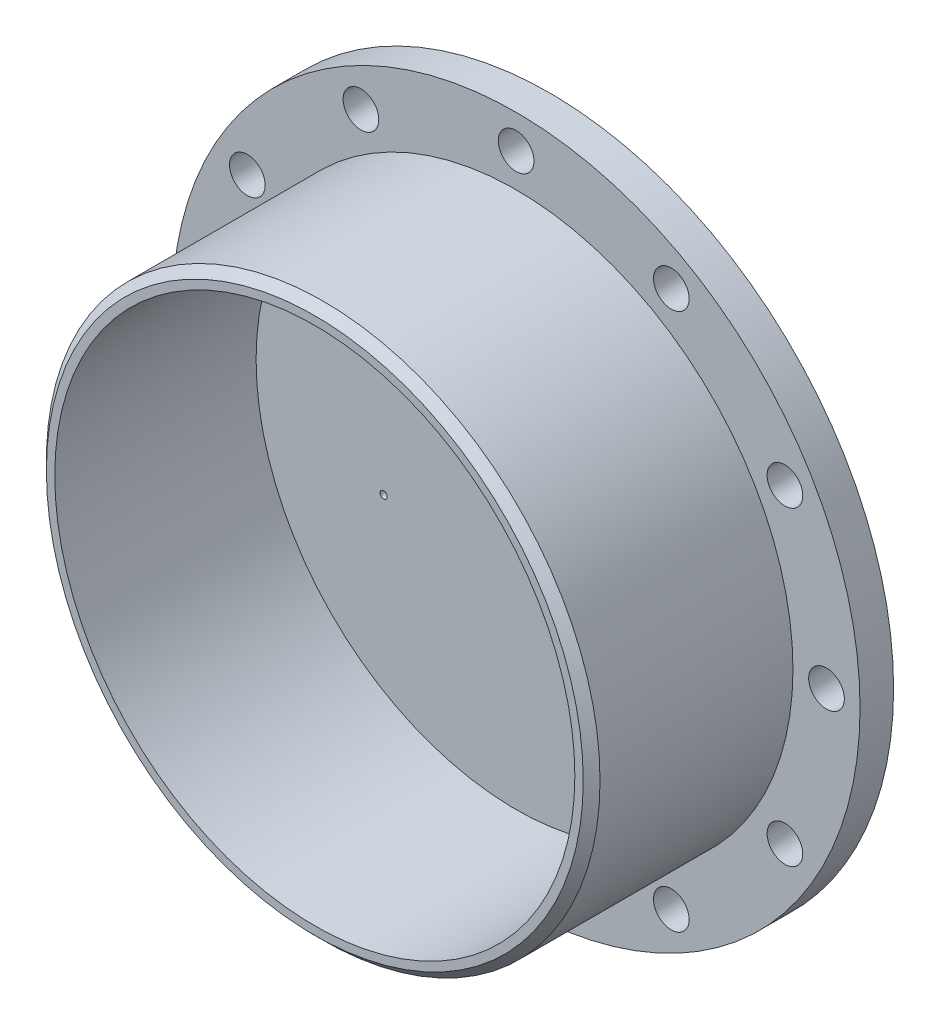
ISO-10303-21;
HEADER;
FILE_DESCRIPTION(('STEP AP214'),'2;1');
FILE_NAME('part.step','',(''),(''),'','','');
FILE_SCHEMA(('AUTOMOTIVE_DESIGN { 1 0 10303 214 1 1 1 1 }'));
ENDSEC;
DATA;
#1=APPLICATION_CONTEXT('core data for automotive mechanical design processes');
#2=APPLICATION_PROTOCOL_DEFINITION('international standard','automotive_design',2000,#1);
#3=PRODUCT_CONTEXT('',#1,'mechanical');
#4=PRODUCT('Part','Part','',(#3));
#5=PRODUCT_RELATED_PRODUCT_CATEGORY('part','',(#4));
#6=PRODUCT_DEFINITION_FORMATION('','',#4);
#7=PRODUCT_DEFINITION_CONTEXT('part definition',#1,'design');
#8=PRODUCT_DEFINITION('design','',#6,#7);
#9=PRODUCT_DEFINITION_SHAPE('','',#8);
#10=(LENGTH_UNIT() NAMED_UNIT(*) SI_UNIT(.MILLI.,.METRE.));
#11=(NAMED_UNIT(*) PLANE_ANGLE_UNIT() SI_UNIT($,.RADIAN.));
#12=(NAMED_UNIT(*) SI_UNIT($,.STERADIAN.) SOLID_ANGLE_UNIT());
#13=UNCERTAINTY_MEASURE_WITH_UNIT(LENGTH_MEASURE(1.E-05),#10,'distance_accuracy_value','');
#14=(GEOMETRIC_REPRESENTATION_CONTEXT(3) GLOBAL_UNCERTAINTY_ASSIGNED_CONTEXT((#13)) GLOBAL_UNIT_ASSIGNED_CONTEXT((#10,
#11,#12)) REPRESENTATION_CONTEXT('',''));
#15=CARTESIAN_POINT('',(0.,0.,0.));
#16=DIRECTION('',(0.,0.,1.));
#17=DIRECTION('',(1.,0.,0.));
#18=AXIS2_PLACEMENT_3D('',#15,#16,#17);
#19=CARTESIAN_POINT('',(0.,0.,82.55));
#20=DIRECTION('',(0.,0.,-1.));
#21=DIRECTION('',(-1.,0.,0.));
#22=AXIS2_PLACEMENT_3D('',#19,#20,#21);
#23=CYLINDRICAL_SURFACE('',#22,98.425);
#24=CARTESIAN_POINT('',(0.,0.,82.55));
#25=DIRECTION('',(0.,0.,1.));
#26=DIRECTION('',(1.,0.,0.));
#27=AXIS2_PLACEMENT_3D('',#24,#25,#26);
#28=CIRCLE('',#27,98.425);
#29=CARTESIAN_POINT('',(98.425,0.,82.55));
#30=VERTEX_POINT('',#29);
#31=EDGE_CURVE('E151',#30,#30,#28,.T.);
#32=ORIENTED_EDGE('',*,*,#31,.T.);
#33=EDGE_LOOP('',(#32));
#34=FACE_BOUND('',#33,.T.);
#35=CARTESIAN_POINT('',(0.,0.,6.35));
#36=DIRECTION('',(0.,0.,-1.));
#37=DIRECTION('',(-1.,0.,0.));
#38=AXIS2_PLACEMENT_3D('',#35,#36,#37);
#39=CIRCLE('',#38,98.425);
#40=CARTESIAN_POINT('',(-98.425,0.,6.35));
#41=VERTEX_POINT('',#40);
#42=EDGE_CURVE('E148',#41,#41,#39,.T.);
#43=ORIENTED_EDGE('',*,*,#42,.T.);
#44=EDGE_LOOP('',(#43));
#45=FACE_BOUND('',#44,.T.);
#46=ADVANCED_FACE('F44',(#34,#45),#23,.F.);
#47=CARTESIAN_POINT('',(0.,0.,6.35));
#48=DIRECTION('',(0.,0.,-1.));
#49=DIRECTION('',(-1.,0.,0.));
#50=AXIS2_PLACEMENT_3D('',#47,#48,#49);
#51=CYLINDRICAL_SURFACE('',#50,130.175);
#52=CARTESIAN_POINT('',(0.,0.,6.35));
#53=DIRECTION('',(0.,0.,1.));
#54=DIRECTION('',(1.,0.,0.));
#55=AXIS2_PLACEMENT_3D('',#52,#53,#54);
#56=CIRCLE('',#55,130.175);
#57=CARTESIAN_POINT('',(130.175,0.,6.35));
#58=VERTEX_POINT('',#57);
#59=EDGE_CURVE('E157',#58,#58,#56,.T.);
#60=ORIENTED_EDGE('',*,*,#59,.F.);
#61=EDGE_LOOP('',(#60));
#62=FACE_BOUND('',#61,.T.);
#63=CARTESIAN_POINT('',(0.,0.,-6.35));
#64=DIRECTION('',(0.,0.,1.));
#65=DIRECTION('',(1.,0.,0.));
#66=AXIS2_PLACEMENT_3D('',#63,#64,#65);
#67=CIRCLE('',#66,130.175);
#68=CARTESIAN_POINT('',(130.175,0.,-6.35));
#69=VERTEX_POINT('',#68);
#70=EDGE_CURVE('E48',#69,#69,#67,.T.);
#71=ORIENTED_EDGE('',*,*,#70,.T.);
#72=EDGE_LOOP('',(#71));
#73=FACE_BOUND('',#72,.T.);
#74=ADVANCED_FACE('F199',(#62,#73),#51,.T.);
#75=CARTESIAN_POINT('',(0.,0.,6.35));
#76=DIRECTION('',(0.,0.,1.));
#77=DIRECTION('',(1.,0.,0.));
#78=AXIS2_PLACEMENT_3D('',#75,#76,#77);
#79=PLANE('',#78);
#80=CARTESIAN_POINT('',(58.7374999999987,101.736334309578,6.35));
#81=DIRECTION('',(0.,0.,1.));
#82=DIRECTION('',(1.,0.,0.));
#83=AXIS2_PLACEMENT_3D('',#80,#81,#82);
#84=CIRCLE('',#83,6.74624);
#85=CARTESIAN_POINT('',(65.4837399999987,101.736334309578,6.35));
#86=VERTEX_POINT('',#85);
#87=EDGE_CURVE('E100',#86,#86,#84,.T.);
#88=ORIENTED_EDGE('',*,*,#87,.F.);
#89=EDGE_LOOP('',(#88));
#90=FACE_BOUND('',#89,.T.);
#91=CARTESIAN_POINT('',(101.736334309576,58.7375000000012,6.35));
#92=DIRECTION('',(0.,0.,1.));
#93=DIRECTION('',(1.,0.,0.));
#94=AXIS2_PLACEMENT_3D('',#91,#92,#93);
#95=CIRCLE('',#94,6.74624);
#96=CARTESIAN_POINT('',(108.482574309576,58.7375000000012,6.35));
#97=VERTEX_POINT('',#96);
#98=EDGE_CURVE('E104',#97,#97,#95,.T.);
#99=ORIENTED_EDGE('',*,*,#98,.F.);
#100=EDGE_LOOP('',(#99));
#101=FACE_BOUND('',#100,.T.);
#102=CARTESIAN_POINT('',(117.475,1.23048531084179E-12,6.35));
#103=DIRECTION('',(0.,0.,1.));
#104=DIRECTION('',(1.,0.,0.));
#105=AXIS2_PLACEMENT_3D('',#102,#103,#104);
#106=CIRCLE('',#105,6.74624);
#107=CARTESIAN_POINT('',(124.22124,1.23048531084179E-12,6.35));
#108=VERTEX_POINT('',#107);
#109=EDGE_CURVE('E108',#108,#108,#106,.T.);
#110=ORIENTED_EDGE('',*,*,#109,.F.);
#111=EDGE_LOOP('',(#110));
#112=FACE_BOUND('',#111,.T.);
#113=CARTESIAN_POINT('',(101.736334309577,-58.7374999999991,6.35));
#114=DIRECTION('',(0.,0.,1.));
#115=DIRECTION('',(1.,0.,0.));
#116=AXIS2_PLACEMENT_3D('',#113,#114,#115);
#117=CIRCLE('',#116,6.74624);
#118=CARTESIAN_POINT('',(108.482574309577,-58.7374999999991,6.35));
#119=VERTEX_POINT('',#118);
#120=EDGE_CURVE('E112',#119,#119,#117,.T.);
#121=ORIENTED_EDGE('',*,*,#120,.F.);
#122=EDGE_LOOP('',(#121));
#123=FACE_BOUND('',#122,.T.);
#124=CARTESIAN_POINT('',(58.7375000000008,-101.736334309576,6.35));
#125=DIRECTION('',(0.,0.,1.));
#126=DIRECTION('',(1.,0.,0.));
#127=AXIS2_PLACEMENT_3D('',#124,#125,#126);
#128=CIRCLE('',#127,6.74624);
#129=CARTESIAN_POINT('',(65.4837400000008,-101.736334309576,6.35));
#130=VERTEX_POINT('',#129);
#131=EDGE_CURVE('E116',#130,#130,#128,.T.);
#132=ORIENTED_EDGE('',*,*,#131,.F.);
#133=EDGE_LOOP('',(#132));
#134=FACE_BOUND('',#133,.T.);
#135=CARTESIAN_POINT('',(0.,-117.475,6.35));
#136=DIRECTION('',(0.,0.,1.));
#137=DIRECTION('',(1.,0.,0.));
#138=AXIS2_PLACEMENT_3D('',#135,#136,#137);
#139=CIRCLE('',#138,6.74624);
#140=CARTESIAN_POINT('',(6.74624,-117.475,6.35));
#141=VERTEX_POINT('',#140);
#142=EDGE_CURVE('E120',#141,#141,#139,.T.);
#143=ORIENTED_EDGE('',*,*,#142,.F.);
#144=EDGE_LOOP('',(#143));
#145=FACE_BOUND('',#144,.T.);
#146=CARTESIAN_POINT('',(-58.7374999999994,-101.736334309577,6.35));
#147=DIRECTION('',(0.,0.,1.));
#148=DIRECTION('',(1.,0.,0.));
#149=AXIS2_PLACEMENT_3D('',#146,#147,#148);
#150=CIRCLE('',#149,6.74624);
#151=CARTESIAN_POINT('',(-51.9912599999994,-101.736334309577,6.35));
#152=VERTEX_POINT('',#151);
#153=EDGE_CURVE('E124',#152,#152,#150,.T.);
#154=ORIENTED_EDGE('',*,*,#153,.F.);
#155=EDGE_LOOP('',(#154));
#156=FACE_BOUND('',#155,.T.);
#157=CARTESIAN_POINT('',(-101.736334309577,-58.7375000000005,6.35));
#158=DIRECTION('',(0.,0.,1.));
#159=DIRECTION('',(1.,0.,0.));
#160=AXIS2_PLACEMENT_3D('',#157,#158,#159);
#161=CIRCLE('',#160,6.74624);
#162=CARTESIAN_POINT('',(-94.9900943095767,-58.7375000000005,6.35));
#163=VERTEX_POINT('',#162);
#164=EDGE_CURVE('E128',#163,#163,#161,.T.);
#165=ORIENTED_EDGE('',*,*,#164,.F.);
#166=EDGE_LOOP('',(#165));
#167=FACE_BOUND('',#166,.T.);
#168=CARTESIAN_POINT('',(-117.475,-4.10161770280597E-13,6.35));
#169=DIRECTION('',(0.,0.,1.));
#170=DIRECTION('',(1.,0.,0.));
#171=AXIS2_PLACEMENT_3D('',#168,#169,#170);
#172=CIRCLE('',#171,6.74624);
#173=CARTESIAN_POINT('',(-110.72876,-4.10161770280597E-13,6.35));
#174=VERTEX_POINT('',#173);
#175=EDGE_CURVE('E132',#174,#174,#172,.T.);
#176=ORIENTED_EDGE('',*,*,#175,.F.);
#177=EDGE_LOOP('',(#176));
#178=FACE_BOUND('',#177,.T.);
#179=CARTESIAN_POINT('',(-101.736334309577,58.7374999999998,6.35));
#180=DIRECTION('',(0.,0.,1.));
#181=DIRECTION('',(1.,0.,0.));
#182=AXIS2_PLACEMENT_3D('',#179,#180,#181);
#183=CIRCLE('',#182,6.74624);
#184=CARTESIAN_POINT('',(-94.9900943095771,58.7374999999998,6.35));
#185=VERTEX_POINT('',#184);
#186=EDGE_CURVE('E136',#185,#185,#183,.T.);
#187=ORIENTED_EDGE('',*,*,#186,.F.);
#188=EDGE_LOOP('',(#187));
#189=FACE_BOUND('',#188,.T.);
#190=CARTESIAN_POINT('',(-58.7375000000001,101.736334309577,6.35));
#191=DIRECTION('',(0.,0.,1.));
#192=DIRECTION('',(1.,0.,0.));
#193=AXIS2_PLACEMENT_3D('',#190,#191,#192);
#194=CIRCLE('',#193,6.74624);
#195=CARTESIAN_POINT('',(-51.9912600000001,101.736334309577,6.35));
#196=VERTEX_POINT('',#195);
#197=EDGE_CURVE('E140',#196,#196,#194,.T.);
#198=ORIENTED_EDGE('',*,*,#197,.F.);
#199=EDGE_LOOP('',(#198));
#200=FACE_BOUND('',#199,.T.);
#201=CARTESIAN_POINT('',(0.,117.475,6.35));
#202=DIRECTION('',(0.,0.,1.));
#203=DIRECTION('',(1.,0.,0.));
#204=AXIS2_PLACEMENT_3D('',#201,#202,#203);
#205=CIRCLE('',#204,6.74624);
#206=CARTESIAN_POINT('',(6.74624,117.475,6.35));
#207=VERTEX_POINT('',#206);
#208=EDGE_CURVE('E144',#207,#207,#205,.T.);
#209=ORIENTED_EDGE('',*,*,#208,.F.);
#210=EDGE_LOOP('',(#209));
#211=FACE_BOUND('',#210,.T.);
#212=CARTESIAN_POINT('',(0.,0.,6.35));
#213=DIRECTION('',(0.,0.,1.));
#214=DIRECTION('',(1.,0.,0.));
#215=AXIS2_PLACEMENT_3D('',#212,#213,#214);
#216=CIRCLE('',#215,104.775);
#217=CARTESIAN_POINT('',(104.775,0.,6.35));
#218=VERTEX_POINT('',#217);
#219=EDGE_CURVE('E154',#218,#218,#216,.T.);
#220=ORIENTED_EDGE('',*,*,#219,.F.);
#221=EDGE_LOOP('',(#220));
#222=FACE_BOUND('',#221,.T.);
#223=ORIENTED_EDGE('',*,*,#59,.T.);
#224=EDGE_LOOP('',(#223));
#225=FACE_BOUND('',#224,.T.);
#226=ADVANCED_FACE('F196',(#90,#101,#112,#123,#134,#145,#156,#167,#178,#189,#200,#211,#222,
#225),#79,.T.);
#227=CARTESIAN_POINT('',(0.,0.,-6.35));
#228=DIRECTION('',(0.,0.,1.));
#229=DIRECTION('',(1.,0.,0.));
#230=AXIS2_PLACEMENT_3D('',#227,#228,#229);
#231=PLANE('',#230);
#232=CARTESIAN_POINT('',(58.7374999999987,101.736334309578,-6.35));
#233=DIRECTION('',(0.,0.,1.));
#234=DIRECTION('',(1.,0.,0.));
#235=AXIS2_PLACEMENT_3D('',#232,#233,#234);
#236=CIRCLE('',#235,6.74624);
#237=CARTESIAN_POINT('',(65.4837399999987,101.736334309578,-6.35));
#238=VERTEX_POINT('',#237);
#239=EDGE_CURVE('E103',#238,#238,#236,.T.);
#240=ORIENTED_EDGE('',*,*,#239,.T.);
#241=EDGE_LOOP('',(#240));
#242=FACE_BOUND('',#241,.T.);
#243=CARTESIAN_POINT('',(101.736334309576,58.7375000000012,-6.35));
#244=DIRECTION('',(0.,0.,1.));
#245=DIRECTION('',(1.,0.,0.));
#246=AXIS2_PLACEMENT_3D('',#243,#244,#245);
#247=CIRCLE('',#246,6.74624);
#248=CARTESIAN_POINT('',(108.482574309576,58.7375000000012,-6.35));
#249=VERTEX_POINT('',#248);
#250=EDGE_CURVE('E107',#249,#249,#247,.T.);
#251=ORIENTED_EDGE('',*,*,#250,.T.);
#252=EDGE_LOOP('',(#251));
#253=FACE_BOUND('',#252,.T.);
#254=CARTESIAN_POINT('',(117.475,1.23048531084179E-12,-6.35));
#255=DIRECTION('',(0.,0.,1.));
#256=DIRECTION('',(1.,0.,0.));
#257=AXIS2_PLACEMENT_3D('',#254,#255,#256);
#258=CIRCLE('',#257,6.74624);
#259=CARTESIAN_POINT('',(124.22124,1.23048531084179E-12,-6.35));
#260=VERTEX_POINT('',#259);
#261=EDGE_CURVE('E111',#260,#260,#258,.T.);
#262=ORIENTED_EDGE('',*,*,#261,.T.);
#263=EDGE_LOOP('',(#262));
#264=FACE_BOUND('',#263,.T.);
#265=CARTESIAN_POINT('',(101.736334309577,-58.7374999999991,-6.35));
#266=DIRECTION('',(0.,0.,1.));
#267=DIRECTION('',(1.,0.,0.));
#268=AXIS2_PLACEMENT_3D('',#265,#266,#267);
#269=CIRCLE('',#268,6.74624);
#270=CARTESIAN_POINT('',(108.482574309577,-58.7374999999991,-6.35));
#271=VERTEX_POINT('',#270);
#272=EDGE_CURVE('E115',#271,#271,#269,.T.);
#273=ORIENTED_EDGE('',*,*,#272,.T.);
#274=EDGE_LOOP('',(#273));
#275=FACE_BOUND('',#274,.T.);
#276=CARTESIAN_POINT('',(58.7375000000008,-101.736334309576,-6.35));
#277=DIRECTION('',(0.,0.,1.));
#278=DIRECTION('',(1.,0.,0.));
#279=AXIS2_PLACEMENT_3D('',#276,#277,#278);
#280=CIRCLE('',#279,6.74624);
#281=CARTESIAN_POINT('',(65.4837400000008,-101.736334309576,-6.35));
#282=VERTEX_POINT('',#281);
#283=EDGE_CURVE('E119',#282,#282,#280,.T.);
#284=ORIENTED_EDGE('',*,*,#283,.T.);
#285=EDGE_LOOP('',(#284));
#286=FACE_BOUND('',#285,.T.);
#287=CARTESIAN_POINT('',(0.,-117.475,-6.35));
#288=DIRECTION('',(0.,0.,1.));
#289=DIRECTION('',(1.,0.,0.));
#290=AXIS2_PLACEMENT_3D('',#287,#288,#289);
#291=CIRCLE('',#290,6.74624);
#292=CARTESIAN_POINT('',(6.74624,-117.475,-6.35));
#293=VERTEX_POINT('',#292);
#294=EDGE_CURVE('E123',#293,#293,#291,.T.);
#295=ORIENTED_EDGE('',*,*,#294,.T.);
#296=EDGE_LOOP('',(#295));
#297=FACE_BOUND('',#296,.T.);
#298=CARTESIAN_POINT('',(-58.7374999999994,-101.736334309577,-6.35));
#299=DIRECTION('',(0.,0.,1.));
#300=DIRECTION('',(1.,0.,0.));
#301=AXIS2_PLACEMENT_3D('',#298,#299,#300);
#302=CIRCLE('',#301,6.74624);
#303=CARTESIAN_POINT('',(-51.9912599999994,-101.736334309577,-6.35));
#304=VERTEX_POINT('',#303);
#305=EDGE_CURVE('E127',#304,#304,#302,.T.);
#306=ORIENTED_EDGE('',*,*,#305,.T.);
#307=EDGE_LOOP('',(#306));
#308=FACE_BOUND('',#307,.T.);
#309=CARTESIAN_POINT('',(-101.736334309577,-58.7375000000005,-6.35));
#310=DIRECTION('',(0.,0.,1.));
#311=DIRECTION('',(1.,0.,0.));
#312=AXIS2_PLACEMENT_3D('',#309,#310,#311);
#313=CIRCLE('',#312,6.74624);
#314=CARTESIAN_POINT('',(-94.9900943095767,-58.7375000000005,-6.35));
#315=VERTEX_POINT('',#314);
#316=EDGE_CURVE('E131',#315,#315,#313,.T.);
#317=ORIENTED_EDGE('',*,*,#316,.T.);
#318=EDGE_LOOP('',(#317));
#319=FACE_BOUND('',#318,.T.);
#320=CARTESIAN_POINT('',(-117.475,-4.10161770280597E-13,-6.35));
#321=DIRECTION('',(0.,0.,1.));
#322=DIRECTION('',(1.,0.,0.));
#323=AXIS2_PLACEMENT_3D('',#320,#321,#322);
#324=CIRCLE('',#323,6.74624);
#325=CARTESIAN_POINT('',(-110.72876,-4.10161770280597E-13,-6.35));
#326=VERTEX_POINT('',#325);
#327=EDGE_CURVE('E135',#326,#326,#324,.T.);
#328=ORIENTED_EDGE('',*,*,#327,.T.);
#329=EDGE_LOOP('',(#328));
#330=FACE_BOUND('',#329,.T.);
#331=CARTESIAN_POINT('',(-101.736334309577,58.7374999999998,-6.35));
#332=DIRECTION('',(0.,0.,1.));
#333=DIRECTION('',(1.,0.,0.));
#334=AXIS2_PLACEMENT_3D('',#331,#332,#333);
#335=CIRCLE('',#334,6.74624);
#336=CARTESIAN_POINT('',(-94.9900943095771,58.7374999999998,-6.35));
#337=VERTEX_POINT('',#336);
#338=EDGE_CURVE('E139',#337,#337,#335,.T.);
#339=ORIENTED_EDGE('',*,*,#338,.T.);
#340=EDGE_LOOP('',(#339));
#341=FACE_BOUND('',#340,.T.);
#342=CARTESIAN_POINT('',(-58.7375000000001,101.736334309577,-6.35));
#343=DIRECTION('',(0.,0.,1.));
#344=DIRECTION('',(1.,0.,0.));
#345=AXIS2_PLACEMENT_3D('',#342,#343,#344);
#346=CIRCLE('',#345,6.74624);
#347=CARTESIAN_POINT('',(-51.9912600000001,101.736334309577,-6.35));
#348=VERTEX_POINT('',#347);
#349=EDGE_CURVE('E143',#348,#348,#346,.T.);
#350=ORIENTED_EDGE('',*,*,#349,.T.);
#351=EDGE_LOOP('',(#350));
#352=FACE_BOUND('',#351,.T.);
#353=CARTESIAN_POINT('',(0.,117.475,-6.35));
#354=DIRECTION('',(0.,0.,1.));
#355=DIRECTION('',(1.,0.,0.));
#356=AXIS2_PLACEMENT_3D('',#353,#354,#355);
#357=CIRCLE('',#356,6.74624);
#358=CARTESIAN_POINT('',(6.74624,117.475,-6.35));
#359=VERTEX_POINT('',#358);
#360=EDGE_CURVE('E147',#359,#359,#357,.T.);
#361=ORIENTED_EDGE('',*,*,#360,.T.);
#362=EDGE_LOOP('',(#361));
#363=FACE_BOUND('',#362,.T.);
#364=ORIENTED_EDGE('',*,*,#70,.F.);
#365=EDGE_LOOP('',(#364));
#366=FACE_BOUND('',#365,.T.);
#367=ADVANCED_FACE('F46',(#242,#253,#264,#275,#286,#297,#308,#319,#330,#341,#352,#363,#366),
#231,.F.);
#368=CARTESIAN_POINT('',(0.,0.,82.55));
#369=DIRECTION('',(0.,0.,1.));
#370=DIRECTION('',(1.,0.,0.));
#371=AXIS2_PLACEMENT_3D('',#368,#369,#370);
#372=PLANE('',#371);
#373=CARTESIAN_POINT('',(0.,0.,82.55));
#374=DIRECTION('',(0.,0.,1.));
#375=DIRECTION('',(1.,0.,0.));
#376=AXIS2_PLACEMENT_3D('',#373,#374,#375);
#377=CIRCLE('',#376,101.6);
#378=CARTESIAN_POINT('',(101.6,0.,82.55));
#379=VERTEX_POINT('',#378);
#380=EDGE_CURVE('E53',#379,#379,#377,.T.);
#381=ORIENTED_EDGE('',*,*,#380,.T.);
#382=EDGE_LOOP('',(#381));
#383=FACE_BOUND('',#382,.T.);
#384=ORIENTED_EDGE('',*,*,#31,.F.);
#385=EDGE_LOOP('',(#384));
#386=FACE_BOUND('',#385,.T.);
#387=ADVANCED_FACE('F212',(#383,#386),#372,.T.);
#388=CARTESIAN_POINT('',(0.,0.,82.55));
#389=DIRECTION('',(0.,0.,-1.));
#390=DIRECTION('',(-1.,0.,0.));
#391=AXIS2_PLACEMENT_3D('',#388,#389,#390);
#392=CYLINDRICAL_SURFACE('',#391,104.775);
#393=CARTESIAN_POINT('',(0.,0.,79.375));
#394=DIRECTION('',(0.,0.,1.));
#395=DIRECTION('',(1.,0.,0.));
#396=AXIS2_PLACEMENT_3D('',#393,#394,#395);
#397=CIRCLE('',#396,104.775);
#398=CARTESIAN_POINT('',(104.775,0.,79.375));
#399=VERTEX_POINT('',#398);
#400=EDGE_CURVE('E12',#399,#399,#397,.F.);
#401=ORIENTED_EDGE('',*,*,#400,.T.);
#402=EDGE_LOOP('',(#401));
#403=FACE_BOUND('',#402,.T.);
#404=ORIENTED_EDGE('',*,*,#219,.T.);
#405=EDGE_LOOP('',(#404));
#406=FACE_BOUND('',#405,.T.);
#407=ADVANCED_FACE('F217',(#403,#406),#392,.T.);
#408=CARTESIAN_POINT('',(0.,0.,6.35));
#409=DIRECTION('',(0.,0.,-1.));
#410=DIRECTION('',(-1.,0.,0.));
#411=AXIS2_PLACEMENT_3D('',#408,#409,#410);
#412=PLANE('',#411);
#413=CARTESIAN_POINT('',(-50.165,20.32,6.35));
#414=DIRECTION('',(0.,0.,1.));
#415=DIRECTION('',(1.,0.,0.));
#416=AXIS2_PLACEMENT_3D('',#413,#414,#415);
#417=CIRCLE('',#416,1.35254999999999);
#418=CARTESIAN_POINT('',(-48.81245,20.32,6.35));
#419=VERTEX_POINT('',#418);
#420=EDGE_CURVE('E78',#419,#419,#417,.T.);
#421=ORIENTED_EDGE('',*,*,#420,.F.);
#422=EDGE_LOOP('',(#421));
#423=FACE_BOUND('',#422,.T.);
#424=CARTESIAN_POINT('',(-50.165,-20.32,6.35));
#425=DIRECTION('',(0.,0.,1.));
#426=DIRECTION('',(1.,0.,0.));
#427=AXIS2_PLACEMENT_3D('',#424,#425,#426);
#428=CIRCLE('',#427,1.35254999999999);
#429=CARTESIAN_POINT('',(-48.81245,-20.32,6.35));
#430=VERTEX_POINT('',#429);
#431=EDGE_CURVE('E77',#430,#430,#428,.T.);
#432=ORIENTED_EDGE('',*,*,#431,.F.);
#433=EDGE_LOOP('',(#432));
#434=FACE_BOUND('',#433,.T.);
#435=CARTESIAN_POINT('',(50.165,-31.75,6.35));
#436=DIRECTION('',(0.,0.,1.));
#437=DIRECTION('',(1.,0.,0.));
#438=AXIS2_PLACEMENT_3D('',#435,#436,#437);
#439=CIRCLE('',#438,1.35254999999999);
#440=CARTESIAN_POINT('',(51.51755,-31.75,6.35));
#441=VERTEX_POINT('',#440);
#442=EDGE_CURVE('E88',#441,#441,#439,.T.);
#443=ORIENTED_EDGE('',*,*,#442,.F.);
#444=EDGE_LOOP('',(#443));
#445=FACE_BOUND('',#444,.T.);
#446=CARTESIAN_POINT('',(50.165,31.75,6.35));
#447=DIRECTION('',(0.,0.,1.));
#448=DIRECTION('',(1.,0.,0.));
#449=AXIS2_PLACEMENT_3D('',#446,#447,#448);
#450=CIRCLE('',#449,1.35254999999999);
#451=CARTESIAN_POINT('',(51.51755,31.75,6.35));
#452=VERTEX_POINT('',#451);
#453=EDGE_CURVE('E94',#452,#452,#450,.T.);
#454=ORIENTED_EDGE('',*,*,#453,.F.);
#455=EDGE_LOOP('',(#454));
#456=FACE_BOUND('',#455,.T.);
#457=ORIENTED_EDGE('',*,*,#42,.F.);
#458=EDGE_LOOP('',(#457));
#459=FACE_BOUND('',#458,.T.);
#460=ADVANCED_FACE('F228',(#423,#434,#445,#456,#459),#412,.F.);
#461=CARTESIAN_POINT('',(0.,0.,82.55));
#462=DIRECTION('',(0.,0.,-1.));
#463=DIRECTION('',(-1.,0.,0.));
#464=AXIS2_PLACEMENT_3D('',#461,#462,#463);
#465=CONICAL_SURFACE('',#464,101.6,0.785398163397448);
#466=ORIENTED_EDGE('',*,*,#400,.F.);
#467=EDGE_LOOP('',(#466));
#468=FACE_BOUND('',#467,.T.);
#469=ORIENTED_EDGE('',*,*,#380,.F.);
#470=EDGE_LOOP('',(#469));
#471=FACE_BOUND('',#470,.T.);
#472=ADVANCED_FACE('F192',(#468,#471),#465,.T.);
#473=CARTESIAN_POINT('',(0.,117.475,6.35));
#474=DIRECTION('',(0.,0.,1.));
#475=DIRECTION('',(1.,0.,0.));
#476=AXIS2_PLACEMENT_3D('',#473,#474,#475);
#477=CYLINDRICAL_SURFACE('',#476,6.74624);
#478=ORIENTED_EDGE('',*,*,#360,.F.);
#479=EDGE_LOOP('',(#478));
#480=FACE_BOUND('',#479,.T.);
#481=ORIENTED_EDGE('',*,*,#208,.T.);
#482=EDGE_LOOP('',(#481));
#483=FACE_BOUND('',#482,.T.);
#484=ADVANCED_FACE('F188',(#480,#483),#477,.F.);
#485=CARTESIAN_POINT('',(-58.7375000000001,101.736334309577,6.35));
#486=DIRECTION('',(0.,0.,1.));
#487=DIRECTION('',(1.,0.,0.));
#488=AXIS2_PLACEMENT_3D('',#485,#486,#487);
#489=CYLINDRICAL_SURFACE('',#488,6.74624);
#490=ORIENTED_EDGE('',*,*,#349,.F.);
#491=EDGE_LOOP('',(#490));
#492=FACE_BOUND('',#491,.T.);
#493=ORIENTED_EDGE('',*,*,#197,.T.);
#494=EDGE_LOOP('',(#493));
#495=FACE_BOUND('',#494,.T.);
#496=ADVANCED_FACE('F191',(#492,#495),#489,.F.);
#497=CARTESIAN_POINT('',(-101.736334309577,58.7374999999998,6.35));
#498=DIRECTION('',(0.,0.,1.));
#499=DIRECTION('',(1.,0.,0.));
#500=AXIS2_PLACEMENT_3D('',#497,#498,#499);
#501=CYLINDRICAL_SURFACE('',#500,6.74624);
#502=ORIENTED_EDGE('',*,*,#338,.F.);
#503=EDGE_LOOP('',(#502));
#504=FACE_BOUND('',#503,.T.);
#505=ORIENTED_EDGE('',*,*,#186,.T.);
#506=EDGE_LOOP('',(#505));
#507=FACE_BOUND('',#506,.T.);
#508=ADVANCED_FACE('F310',(#504,#507),#501,.F.);
#509=CARTESIAN_POINT('',(-117.475,-4.10161770280597E-13,6.35));
#510=DIRECTION('',(0.,0.,1.));
#511=DIRECTION('',(1.,0.,0.));
#512=AXIS2_PLACEMENT_3D('',#509,#510,#511);
#513=CYLINDRICAL_SURFACE('',#512,6.74624);
#514=ORIENTED_EDGE('',*,*,#327,.F.);
#515=EDGE_LOOP('',(#514));
#516=FACE_BOUND('',#515,.T.);
#517=ORIENTED_EDGE('',*,*,#175,.T.);
#518=EDGE_LOOP('',(#517));
#519=FACE_BOUND('',#518,.T.);
#520=ADVANCED_FACE('F306',(#516,#519),#513,.F.);
#521=CARTESIAN_POINT('',(-101.736334309577,-58.7375000000005,6.35));
#522=DIRECTION('',(0.,0.,1.));
#523=DIRECTION('',(1.,0.,0.));
#524=AXIS2_PLACEMENT_3D('',#521,#522,#523);
#525=CYLINDRICAL_SURFACE('',#524,6.74624);
#526=ORIENTED_EDGE('',*,*,#316,.F.);
#527=EDGE_LOOP('',(#526));
#528=FACE_BOUND('',#527,.T.);
#529=ORIENTED_EDGE('',*,*,#164,.T.);
#530=EDGE_LOOP('',(#529));
#531=FACE_BOUND('',#530,.T.);
#532=ADVANCED_FACE('F302',(#528,#531),#525,.F.);
#533=CARTESIAN_POINT('',(-58.7374999999994,-101.736334309577,6.35));
#534=DIRECTION('',(0.,0.,1.));
#535=DIRECTION('',(1.,0.,0.));
#536=AXIS2_PLACEMENT_3D('',#533,#534,#535);
#537=CYLINDRICAL_SURFACE('',#536,6.74624);
#538=ORIENTED_EDGE('',*,*,#305,.F.);
#539=EDGE_LOOP('',(#538));
#540=FACE_BOUND('',#539,.T.);
#541=ORIENTED_EDGE('',*,*,#153,.T.);
#542=EDGE_LOOP('',(#541));
#543=FACE_BOUND('',#542,.T.);
#544=ADVANCED_FACE('F298',(#540,#543),#537,.F.);
#545=CARTESIAN_POINT('',(0.,-117.475,6.35));
#546=DIRECTION('',(0.,0.,1.));
#547=DIRECTION('',(1.,0.,0.));
#548=AXIS2_PLACEMENT_3D('',#545,#546,#547);
#549=CYLINDRICAL_SURFACE('',#548,6.74624);
#550=ORIENTED_EDGE('',*,*,#294,.F.);
#551=EDGE_LOOP('',(#550));
#552=FACE_BOUND('',#551,.T.);
#553=ORIENTED_EDGE('',*,*,#142,.T.);
#554=EDGE_LOOP('',(#553));
#555=FACE_BOUND('',#554,.T.);
#556=ADVANCED_FACE('F294',(#552,#555),#549,.F.);
#557=CARTESIAN_POINT('',(58.7375000000008,-101.736334309576,6.35));
#558=DIRECTION('',(0.,0.,1.));
#559=DIRECTION('',(1.,0.,0.));
#560=AXIS2_PLACEMENT_3D('',#557,#558,#559);
#561=CYLINDRICAL_SURFACE('',#560,6.74624);
#562=ORIENTED_EDGE('',*,*,#283,.F.);
#563=EDGE_LOOP('',(#562));
#564=FACE_BOUND('',#563,.T.);
#565=ORIENTED_EDGE('',*,*,#131,.T.);
#566=EDGE_LOOP('',(#565));
#567=FACE_BOUND('',#566,.T.);
#568=ADVANCED_FACE('F290',(#564,#567),#561,.F.);
#569=CARTESIAN_POINT('',(101.736334309577,-58.7374999999991,6.35));
#570=DIRECTION('',(0.,0.,1.));
#571=DIRECTION('',(1.,0.,0.));
#572=AXIS2_PLACEMENT_3D('',#569,#570,#571);
#573=CYLINDRICAL_SURFACE('',#572,6.74624);
#574=ORIENTED_EDGE('',*,*,#272,.F.);
#575=EDGE_LOOP('',(#574));
#576=FACE_BOUND('',#575,.T.);
#577=ORIENTED_EDGE('',*,*,#120,.T.);
#578=EDGE_LOOP('',(#577));
#579=FACE_BOUND('',#578,.T.);
#580=ADVANCED_FACE('F286',(#576,#579),#573,.F.);
#581=CARTESIAN_POINT('',(117.475,1.23048531084179E-12,6.35));
#582=DIRECTION('',(0.,0.,1.));
#583=DIRECTION('',(1.,0.,0.));
#584=AXIS2_PLACEMENT_3D('',#581,#582,#583);
#585=CYLINDRICAL_SURFACE('',#584,6.74624);
#586=ORIENTED_EDGE('',*,*,#261,.F.);
#587=EDGE_LOOP('',(#586));
#588=FACE_BOUND('',#587,.T.);
#589=ORIENTED_EDGE('',*,*,#109,.T.);
#590=EDGE_LOOP('',(#589));
#591=FACE_BOUND('',#590,.T.);
#592=ADVANCED_FACE('F282',(#588,#591),#585,.F.);
#593=CARTESIAN_POINT('',(101.736334309576,58.7375000000012,6.35));
#594=DIRECTION('',(0.,0.,1.));
#595=DIRECTION('',(1.,0.,0.));
#596=AXIS2_PLACEMENT_3D('',#593,#594,#595);
#597=CYLINDRICAL_SURFACE('',#596,6.74624);
#598=ORIENTED_EDGE('',*,*,#250,.F.);
#599=EDGE_LOOP('',(#598));
#600=FACE_BOUND('',#599,.T.);
#601=ORIENTED_EDGE('',*,*,#98,.T.);
#602=EDGE_LOOP('',(#601));
#603=FACE_BOUND('',#602,.T.);
#604=ADVANCED_FACE('F278',(#600,#603),#597,.F.);
#605=CARTESIAN_POINT('',(58.7374999999987,101.736334309578,6.35));
#606=DIRECTION('',(0.,0.,1.));
#607=DIRECTION('',(1.,0.,0.));
#608=AXIS2_PLACEMENT_3D('',#605,#606,#607);
#609=CYLINDRICAL_SURFACE('',#608,6.74624);
#610=ORIENTED_EDGE('',*,*,#239,.F.);
#611=EDGE_LOOP('',(#610));
#612=FACE_BOUND('',#611,.T.);
#613=ORIENTED_EDGE('',*,*,#87,.T.);
#614=EDGE_LOOP('',(#613));
#615=FACE_BOUND('',#614,.T.);
#616=ADVANCED_FACE('F271',(#612,#615),#609,.F.);
#617=CARTESIAN_POINT('',(50.165,31.75,0.));
#618=DIRECTION('',(0.,0.,1.));
#619=DIRECTION('',(1.,0.,0.));
#620=AXIS2_PLACEMENT_3D('',#617,#618,#619);
#621=CONICAL_SURFACE('',#620,1.35255,1.02974425867665);
#622=CARTESIAN_POINT('',(50.165,31.75,-0.812694030265727));
#623=VERTEX_POINT('',#622);
#624=VERTEX_LOOP('',#623);
#625=FACE_BOUND('',#624,.T.);
#626=CARTESIAN_POINT('',(50.165,31.75,0.));
#627=DIRECTION('',(0.,0.,1.));
#628=DIRECTION('',(1.,0.,0.));
#629=AXIS2_PLACEMENT_3D('',#626,#627,#628);
#630=CIRCLE('',#629,1.35255);
#631=CARTESIAN_POINT('',(51.51755,31.75,0.));
#632=VERTEX_POINT('',#631);
#633=EDGE_CURVE('E97',#632,#632,#630,.T.);
#634=ORIENTED_EDGE('',*,*,#633,.T.);
#635=EDGE_LOOP('',(#634));
#636=FACE_BOUND('',#635,.T.);
#637=ADVANCED_FACE('F262',(#625,#636),#621,.F.);
#638=CARTESIAN_POINT('',(50.165,31.75,6.35));
#639=DIRECTION('',(0.,0.,1.));
#640=DIRECTION('',(1.,0.,0.));
#641=AXIS2_PLACEMENT_3D('',#638,#639,#640);
#642=CYLINDRICAL_SURFACE('',#641,1.35254999999999);
#643=ORIENTED_EDGE('',*,*,#633,.F.);
#644=EDGE_LOOP('',(#643));
#645=FACE_BOUND('',#644,.T.);
#646=ORIENTED_EDGE('',*,*,#453,.T.);
#647=EDGE_LOOP('',(#646));
#648=FACE_BOUND('',#647,.T.);
#649=ADVANCED_FACE('F259',(#645,#648),#642,.F.);
#650=CARTESIAN_POINT('',(50.165,-31.75,0.));
#651=DIRECTION('',(0.,0.,1.));
#652=DIRECTION('',(1.,0.,0.));
#653=AXIS2_PLACEMENT_3D('',#650,#651,#652);
#654=CONICAL_SURFACE('',#653,1.35255,1.02974425867665);
#655=CARTESIAN_POINT('',(50.165,-31.75,-0.812694030265727));
#656=VERTEX_POINT('',#655);
#657=VERTEX_LOOP('',#656);
#658=FACE_BOUND('',#657,.T.);
#659=CARTESIAN_POINT('',(50.165,-31.75,0.));
#660=DIRECTION('',(0.,0.,1.));
#661=DIRECTION('',(1.,0.,0.));
#662=AXIS2_PLACEMENT_3D('',#659,#660,#661);
#663=CIRCLE('',#662,1.35255);
#664=CARTESIAN_POINT('',(51.51755,-31.75,0.));
#665=VERTEX_POINT('',#664);
#666=EDGE_CURVE('E91',#665,#665,#663,.T.);
#667=ORIENTED_EDGE('',*,*,#666,.T.);
#668=EDGE_LOOP('',(#667));
#669=FACE_BOUND('',#668,.T.);
#670=ADVANCED_FACE('F261',(#658,#669),#654,.F.);
#671=CARTESIAN_POINT('',(50.165,-31.75,6.35));
#672=DIRECTION('',(0.,0.,1.));
#673=DIRECTION('',(1.,0.,0.));
#674=AXIS2_PLACEMENT_3D('',#671,#672,#673);
#675=CYLINDRICAL_SURFACE('',#674,1.35254999999999);
#676=ORIENTED_EDGE('',*,*,#666,.F.);
#677=EDGE_LOOP('',(#676));
#678=FACE_BOUND('',#677,.T.);
#679=ORIENTED_EDGE('',*,*,#442,.T.);
#680=EDGE_LOOP('',(#679));
#681=FACE_BOUND('',#680,.T.);
#682=ADVANCED_FACE('F269',(#678,#681),#675,.F.);
#683=CARTESIAN_POINT('',(-50.165,-20.32,0.));
#684=DIRECTION('',(0.,0.,1.));
#685=DIRECTION('',(1.,0.,0.));
#686=AXIS2_PLACEMENT_3D('',#683,#684,#685);
#687=CONICAL_SURFACE('',#686,1.35255,1.02974425867665);
#688=CARTESIAN_POINT('',(-50.165,-20.32,-0.812694030265727));
#689=VERTEX_POINT('',#688);
#690=VERTEX_LOOP('',#689);
#691=FACE_BOUND('',#690,.T.);
#692=CARTESIAN_POINT('',(-50.165,-20.32,0.));
#693=DIRECTION('',(0.,0.,1.));
#694=DIRECTION('',(1.,0.,0.));
#695=AXIS2_PLACEMENT_3D('',#692,#693,#694);
#696=CIRCLE('',#695,1.35255);
#697=CARTESIAN_POINT('',(-48.81245,-20.32,0.));
#698=VERTEX_POINT('',#697);
#699=EDGE_CURVE('E81',#698,#698,#696,.T.);
#700=ORIENTED_EDGE('',*,*,#699,.T.);
#701=EDGE_LOOP('',(#700));
#702=FACE_BOUND('',#701,.T.);
#703=ADVANCED_FACE('F391',(#691,#702),#687,.F.);
#704=CARTESIAN_POINT('',(-50.165,-20.32,6.35));
#705=DIRECTION('',(0.,0.,1.));
#706=DIRECTION('',(1.,0.,0.));
#707=AXIS2_PLACEMENT_3D('',#704,#705,#706);
#708=CYLINDRICAL_SURFACE('',#707,1.35254999999999);
#709=ORIENTED_EDGE('',*,*,#699,.F.);
#710=EDGE_LOOP('',(#709));
#711=FACE_BOUND('',#710,.T.);
#712=ORIENTED_EDGE('',*,*,#431,.T.);
#713=EDGE_LOOP('',(#712));
#714=FACE_BOUND('',#713,.T.);
#715=ADVANCED_FACE('F71',(#711,#714),#708,.F.);
#716=CARTESIAN_POINT('',(-50.165,20.32,0.));
#717=DIRECTION('',(0.,0.,1.));
#718=DIRECTION('',(1.,0.,0.));
#719=AXIS2_PLACEMENT_3D('',#716,#717,#718);
#720=CONICAL_SURFACE('',#719,1.35255,1.02974425867665);
#721=CARTESIAN_POINT('',(-50.165,20.32,-0.812694030265727));
#722=VERTEX_POINT('',#721);
#723=VERTEX_LOOP('',#722);
#724=FACE_BOUND('',#723,.T.);
#725=CARTESIAN_POINT('',(-50.165,20.32,0.));
#726=DIRECTION('',(0.,0.,1.));
#727=DIRECTION('',(1.,0.,0.));
#728=AXIS2_PLACEMENT_3D('',#725,#726,#727);
#729=CIRCLE('',#728,1.35255);
#730=CARTESIAN_POINT('',(-48.81245,20.32,0.));
#731=VERTEX_POINT('',#730);
#732=EDGE_CURVE('E75',#731,#731,#729,.T.);
#733=ORIENTED_EDGE('',*,*,#732,.T.);
#734=EDGE_LOOP('',(#733));
#735=FACE_BOUND('',#734,.T.);
#736=ADVANCED_FACE('F67',(#724,#735),#720,.F.);
#737=CARTESIAN_POINT('',(-50.165,20.32,6.35));
#738=DIRECTION('',(0.,0.,1.));
#739=DIRECTION('',(1.,0.,0.));
#740=AXIS2_PLACEMENT_3D('',#737,#738,#739);
#741=CYLINDRICAL_SURFACE('',#740,1.35254999999999);
#742=ORIENTED_EDGE('',*,*,#732,.F.);
#743=EDGE_LOOP('',(#742));
#744=FACE_BOUND('',#743,.T.);
#745=ORIENTED_EDGE('',*,*,#420,.T.);
#746=EDGE_LOOP('',(#745));
#747=FACE_BOUND('',#746,.T.);
#748=ADVANCED_FACE('F70',(#744,#747),#741,.F.);
#749=CLOSED_SHELL('',(#46,#74,#226,#367,#387,#407,#460,#472,#484,#496,#508,#520,#532,#544,#556,
#568,#580,#592,#604,#616,#637,#649,#670,#682,#703,#715,#736,#748));
#750=MANIFOLD_SOLID_BREP('B2',#749);
#751=ADVANCED_BREP_SHAPE_REPRESENTATION('',(#18,#750),#14);
#752=SHAPE_DEFINITION_REPRESENTATION(#9,#751);
ENDSEC;
END-ISO-10303-21;
